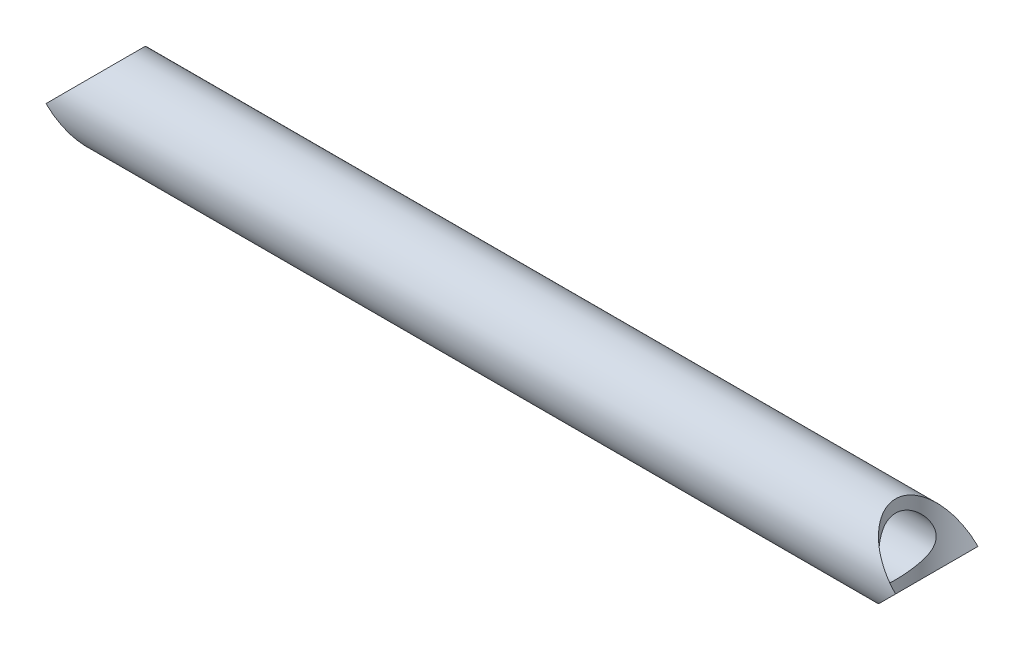
ISO-10303-21;
HEADER;
FILE_DESCRIPTION(('STEP AP214'),'2;1');
FILE_NAME('part.step','',(''),(''),'','','');
FILE_SCHEMA(('AUTOMOTIVE_DESIGN { 1 0 10303 214 1 1 1 1 }'));
ENDSEC;
DATA;
#1=APPLICATION_CONTEXT('core data for automotive mechanical design processes');
#2=APPLICATION_PROTOCOL_DEFINITION('international standard','automotive_design',2000,#1);
#3=PRODUCT_CONTEXT('',#1,'mechanical');
#4=PRODUCT('Part','Part','',(#3));
#5=PRODUCT_RELATED_PRODUCT_CATEGORY('part','',(#4));
#6=PRODUCT_DEFINITION_FORMATION('','',#4);
#7=PRODUCT_DEFINITION_CONTEXT('part definition',#1,'design');
#8=PRODUCT_DEFINITION('design','',#6,#7);
#9=PRODUCT_DEFINITION_SHAPE('','',#8);
#10=(LENGTH_UNIT() NAMED_UNIT(*) SI_UNIT(.MILLI.,.METRE.));
#11=(NAMED_UNIT(*) PLANE_ANGLE_UNIT() SI_UNIT($,.RADIAN.));
#12=(NAMED_UNIT(*) SI_UNIT($,.STERADIAN.) SOLID_ANGLE_UNIT());
#13=UNCERTAINTY_MEASURE_WITH_UNIT(LENGTH_MEASURE(1.E-05),#10,'distance_accuracy_value','');
#14=(GEOMETRIC_REPRESENTATION_CONTEXT(3) GLOBAL_UNCERTAINTY_ASSIGNED_CONTEXT((#13)) GLOBAL_UNIT_ASSIGNED_CONTEXT((#10,
#11,#12)) REPRESENTATION_CONTEXT('',''));
#15=CARTESIAN_POINT('',(0.,0.,0.));
#16=DIRECTION('',(0.,0.,1.));
#17=DIRECTION('',(1.,0.,0.));
#18=AXIS2_PLACEMENT_3D('',#15,#16,#17);
#19=CARTESIAN_POINT('',(0.,0.,0.));
#20=DIRECTION('',(1.,0.,0.));
#21=DIRECTION('',(0.,0.,-1.));
#22=AXIS2_PLACEMENT_3D('',#19,#20,#21);
#23=CYLINDRICAL_SURFACE('',#22,35.);
#24=CARTESIAN_POINT('',(35.7071421427142,0.,-35.));
#25=CARTESIAN_POINT('',(35.7071506960339,0.840107969640403,-34.999995372535));
#26=CARTESIAN_POINT('',(35.7369348035131,1.68027595587627,-34.9696838888615));
#27=CARTESIAN_POINT('',(35.8544471947958,3.35221612686096,-34.8491819248762));
#28=CARTESIAN_POINT('',(35.9421828399308,4.1839872313608,-34.7589838374224));
#29=CARTESIAN_POINT('',(36.1712293688525,5.83320919168844,-34.5205642195381));
#30=CARTESIAN_POINT('',(36.3126425511041,6.65062956617838,-34.3722318793915));
#31=CARTESIAN_POINT('',(36.6423988735656,8.26372825663241,-34.0204719036504));
#32=CARTESIAN_POINT('',(36.8307439251374,9.0594056856216,-33.8170420241069));
#33=CARTESIAN_POINT('',(37.2443889590487,10.6160962668867,-33.3608911380292));
#34=CARTESIAN_POINT('',(37.4692473366944,11.377399510945,-33.1087530503742));
#35=CARTESIAN_POINT('',(37.9498912115004,12.8722697515329,-32.5567138302996));
#36=CARTESIAN_POINT('',(38.2056760937748,13.6058372991278,-32.2568136474564));
#37=CARTESIAN_POINT('',(38.7410119421266,15.0436443658859,-31.6118578615202));
#38=CARTESIAN_POINT('',(39.020559923923,15.7478875512387,-31.2668079256177));
#39=CARTESIAN_POINT('',(39.5969082877492,17.1262102767459,-30.5336264742114));
#40=CARTESIAN_POINT('',(39.8937099050371,17.8002876510772,-30.1454918722869));
#41=CARTESIAN_POINT('',(40.551609749269,19.2329409336998,-29.2561784374031));
#42=CARTESIAN_POINT('',(40.914864074247,19.985636533046,-28.7471070972688));
#43=CARTESIAN_POINT('',(41.6482789820097,21.4471112794062,-27.6738766652288));
#44=CARTESIAN_POINT('',(42.0184400774716,22.1558871493288,-27.1097134706892));
#45=CARTESIAN_POINT('',(42.7582340933028,23.5287326231606,-25.9272125065644));
#46=CARTESIAN_POINT('',(43.127865884777,24.1927488103879,-25.3088119653039));
#47=CARTESIAN_POINT('',(43.8588504301021,25.4730222520025,-24.0197921583749));
#48=CARTESIAN_POINT('',(44.2202026109753,26.0892762080667,-23.3491692927814));
#49=CARTESIAN_POINT('',(44.9867285846432,27.3698937944522,-21.8408769297574));
#50=CARTESIAN_POINT('',(45.389154931207,28.0251298541144,-20.9940046961307));
#51=CARTESIAN_POINT('',(46.1625833914162,29.261175575932,-19.2338365369213));
#52=CARTESIAN_POINT('',(46.5335797092928,29.8419715212443,-18.3205284178719));
#53=CARTESIAN_POINT('',(47.2331338246412,30.9214761037239,-16.432938159996));
#54=CARTESIAN_POINT('',(47.561759750431,31.4203168818842,-15.4587577411312));
#55=CARTESIAN_POINT('',(48.0156533510476,32.1018921667805,-13.9560498011597));
#56=CARTESIAN_POINT('',(48.1604408743064,32.3179655365879,-13.4482527308478));
#57=CARTESIAN_POINT('',(48.4358774539447,32.7270090161536,-12.4197059332497));
#58=CARTESIAN_POINT('',(48.5665277966041,32.9199812279547,-11.8989573896723));
#59=CARTESIAN_POINT('',(48.8692939322469,33.36533512942,-10.6026563492037));
#60=CARTESIAN_POINT('',(49.0327544374962,33.6040865614514,-9.82032326239985));
#61=CARTESIAN_POINT('',(49.3238132945429,34.0273736921218,-8.23474760358175));
#62=CARTESIAN_POINT('',(49.4514179853557,34.2119189742274,-7.43150875500591));
#63=CARTESIAN_POINT('',(49.6680897633444,34.5243655933765,-5.80945738690225));
#64=CARTESIAN_POINT('',(49.7571815736647,34.6523032706249,-4.99065521170869));
#65=CARTESIAN_POINT('',(49.8949954169263,34.8499008596341,-3.3426287169344));
#66=CARTESIAN_POINT('',(49.9437160792339,34.9195587927502,-2.51340404447149));
#67=CARTESIAN_POINT('',(49.9997369695583,34.9996360491842,-0.849064569498375));
#68=CARTESIAN_POINT('',(50.0069561404409,35.0099394464219,-0.0139414278536153));
#69=CARTESIAN_POINT('',(49.9795905662272,34.9708402171738,1.65420898993208));
#70=CARTESIAN_POINT('',(49.9450059780367,34.9214378147871,2.48723627392784));
#71=CARTESIAN_POINT('',(49.8348110399218,34.7636530151837,4.14511747217352));
#72=CARTESIAN_POINT('',(49.7591911431662,34.6552568931089,4.96996943895306));
#73=CARTESIAN_POINT('',(49.5686015156259,34.3810407659299,6.60541848255173));
#74=CARTESIAN_POINT('',(49.4536317547529,34.2152207169174,7.41601554847058));
#75=CARTESIAN_POINT('',(49.1898587017827,33.8328374554661,8.99928619345004));
#76=CARTESIAN_POINT('',(49.0418920994671,33.6175256222774,9.77240316665133));
#77=CARTESIAN_POINT('',(48.7135826943793,33.1367465419105,11.2957516606701));
#78=CARTESIAN_POINT('',(48.5332406093663,32.8712804066381,12.0459836884118));
#79=CARTESIAN_POINT('',(48.1434050941599,32.2929262141351,13.5201301256891));
#80=CARTESIAN_POINT('',(47.9339096891927,31.9800349443149,14.2440427482201));
#81=CARTESIAN_POINT('',(47.4892792776534,31.3096561009199,15.6627291841093));
#82=CARTESIAN_POINT('',(47.2541427471497,30.9521658765087,16.357501262153));
#83=CARTESIAN_POINT('',(46.7342706947119,30.1528495944223,17.7919451807377));
#84=CARTESIAN_POINT('',(46.4469302640876,29.706061440908,18.5279083304046));
#85=CARTESIAN_POINT('',(45.8502583157375,28.7641961243084,19.9588293889626));
#86=CARTESIAN_POINT('',(45.5409254056233,28.2691159030151,20.6537846964576));
#87=CARTESIAN_POINT('',(44.905268593313,27.2332625058387,22.0016486225769));
#88=CARTESIAN_POINT('',(44.5789290915864,26.6924470851888,22.654517363894));
#89=CARTESIAN_POINT('',(43.9149486782088,25.5681155096849,23.9162202003436));
#90=CARTESIAN_POINT('',(43.5773072082628,24.9845972437003,24.525052115434));
#91=CARTESIAN_POINT('',(42.835453936168,23.6690082982129,25.8023689370088));
#92=CARTESIAN_POINT('',(42.4301260058014,22.92902281227,26.4620778543904));
#93=CARTESIAN_POINT('',(41.6212145950747,21.3950999291498,27.7169969188899));
#94=CARTESIAN_POINT('',(41.2176314814372,20.6011517256226,28.3121940848647));
#95=CARTESIAN_POINT('',(40.4229970554186,18.9613586582519,29.43560043687));
#96=CARTESIAN_POINT('',(40.0319444300682,18.1155192589181,29.9638166585617));
#97=CARTESIAN_POINT('',(39.274391070172,16.373534809267,30.9500992369552));
#98=CARTESIAN_POINT('',(38.9078831878682,15.4774045452744,31.4081860666885));
#99=CARTESIAN_POINT('',(38.2935106806577,13.8499610572788,32.1524984022248));
#100=CARTESIAN_POINT('',(38.0378273201614,13.1285437735056,32.4539558035031));
#101=CARTESIAN_POINT('',(37.5558036344604,11.658489952514,33.0105609907163));
#102=CARTESIAN_POINT('',(37.3294600136631,10.9098564844763,33.2657139790946));
#103=CARTESIAN_POINT('',(36.913619808298,9.38878642354701,33.7265624284367));
#104=CARTESIAN_POINT('',(36.7240655804419,8.61638930124983,33.9323353818856));
#105=CARTESIAN_POINT('',(36.3884746528101,7.05024847858442,34.2919745133211));
#106=CARTESIAN_POINT('',(36.2424374542712,6.25650502298735,34.4458412862246));
#107=CARTESIAN_POINT('',(35.9990014609517,4.64420789567828,34.7001963111161));
#108=CARTESIAN_POINT('',(35.9021245730269,3.82548200533228,34.8001124863692));
#109=CARTESIAN_POINT('',(35.7986174570841,2.59037712675722,34.9064627321118));
#110=CARTESIAN_POINT('',(35.7710820185749,2.17743677544965,34.9346598809064));
#111=CARTESIAN_POINT('',(35.7302726607355,1.35012910288847,34.9763998951334));
#112=CARTESIAN_POINT('',(35.7169969035873,0.935761972428675,34.9899446489994));
#113=CARTESIAN_POINT('',(35.7048954563494,0.106691028185822,35.0022927186814));
#114=CARTESIAN_POINT('',(35.7060667644854,-0.308012697754987,35.0010990967995));
#115=CARTESIAN_POINT('',(35.7228314393242,-1.13680514686352,34.9839886104874));
#116=CARTESIAN_POINT('',(35.7384241537951,-1.55089389699623,34.9680724119102));
#117=CARTESIAN_POINT('',(35.7838226288508,-2.3774371534342,34.9216136308916));
#118=CARTESIAN_POINT('',(35.8136272747461,-2.78989178535105,34.8910721955558));
#119=CARTESIAN_POINT('',(35.8870522222923,-3.61225163317412,34.8155455653265));
#120=CARTESIAN_POINT('',(35.9306737746918,-4.02215661485162,34.7705590628161));
#121=CARTESIAN_POINT('',(36.0674353440016,-5.13275958039296,34.628830086058));
#122=CARTESIAN_POINT('',(36.1736069266568,-5.83014671179401,34.5181524617777));
#123=CARTESIAN_POINT('',(36.4216177149305,-7.21081339858577,34.2563585102615));
#124=CARTESIAN_POINT('',(36.5634600998927,-7.89409169057616,34.1052385783199));
#125=CARTESIAN_POINT('',(36.7996706714261,-8.90638582719782,33.8496330627377));
#126=CARTESIAN_POINT('',(36.8823645332531,-9.24188471101654,33.7595558421607));
#127=CARTESIAN_POINT('',(37.0549594724068,-9.90825578804266,33.5700224936967));
#128=CARTESIAN_POINT('',(37.1448587128163,-10.2391291353681,33.4705687550979));
#129=CARTESIAN_POINT('',(37.4245511873983,-11.2247039209303,33.1584238688599));
#130=CARTESIAN_POINT('',(37.6243163755767,-11.8722636876034,32.9319734954838));
#131=CARTESIAN_POINT('',(38.1450116429683,-13.4471289901202,32.3292847026574));
#132=CARTESIAN_POINT('',(38.4786826354399,-14.3624821169311,31.9327431276927));
#133=CARTESIAN_POINT('',(39.17935195492,-16.1460468025932,31.0690795732735));
#134=CARTESIAN_POINT('',(39.5463636510368,-17.0142392257618,30.6019292305053));
#135=CARTESIAN_POINT('',(40.301755140756,-18.7030125712252,29.6000468705433));
#136=CARTESIAN_POINT('',(40.6901690992031,-19.5235128045581,29.0652049211536));
#137=CARTESIAN_POINT('',(41.4766613548323,-21.1137610555909,27.9313912336668));
#138=CARTESIAN_POINT('',(41.8747385293508,-21.8835149307104,27.3324269179354));
#139=CARTESIAN_POINT('',(42.6782094469072,-23.3845880727686,26.0604489027733));
#140=CARTESIAN_POINT('',(43.0835991051203,-24.1149044709452,25.3862484916673));
#141=CARTESIAN_POINT('',(43.8845241661419,-25.5182947538454,23.9751284614132));
#142=CARTESIAN_POINT('',(44.2800588422473,-26.1913644259963,23.2382042346232));
#143=CARTESIAN_POINT('',(45.0516121398882,-27.4756407183392,21.7045656028507));
#144=CARTESIAN_POINT('',(45.4276553690046,-28.0869263146648,20.9079298540213));
#145=CARTESIAN_POINT('',(46.1519228719792,-29.2438607968108,19.2564928275713));
#146=CARTESIAN_POINT('',(46.5001524117578,-29.7895221171094,18.4017026172605));
#147=CARTESIAN_POINT('',(47.1070354510041,-30.7274970425655,16.7795041914442));
#148=CARTESIAN_POINT('',(47.3710826196034,-31.130353940521,16.0201979371559));
#149=CARTESIAN_POINT('',(47.8686375255639,-31.8823772598025,14.4657940381274));
#150=CARTESIAN_POINT('',(48.1021481674375,-32.2315487880222,13.6706998070806));
#151=CARTESIAN_POINT('',(48.5338342134184,-32.8723150806321,12.0486880086856));
#152=CARTESIAN_POINT('',(48.7320243632472,-33.1639338778232,11.2217838975692));
#153=CARTESIAN_POINT('',(49.0888678981733,-33.686099501524,9.54051455852408));
#154=CARTESIAN_POINT('',(49.2475209407915,-33.9166457990113,8.68614909279145));
#155=CARTESIAN_POINT('',(49.5223628402394,-34.3145050274897,6.95066907682188));
#156=CARTESIAN_POINT('',(49.6382983456405,-34.4814408876361,6.06942746964133));
#157=CARTESIAN_POINT('',(49.8234712104536,-34.747480837529,4.29186573010808));
#158=CARTESIAN_POINT('',(49.89270839869,-34.8465846786329,3.39554554249624));
#159=CARTESIAN_POINT('',(49.9826479611912,-34.9752371825238,1.59576611558513));
#160=CARTESIAN_POINT('',(50.0033653249028,-35.0048073266787,0.692309167644005));
#161=CARTESIAN_POINT('',(49.9957458354449,-34.9939228964912,-1.11393360341865));
#162=CARTESIAN_POINT('',(49.967412667374,-34.9534735826137,-2.01671947185972));
#163=CARTESIAN_POINT('',(49.8675605979219,-34.8105711222887,-3.72659142724014));
#164=CARTESIAN_POINT('',(49.8004867088333,-34.7144977394336,-4.53448332214181));
#165=CARTESIAN_POINT('',(49.6284147166179,-34.4671937596204,-6.13760931900885));
#166=CARTESIAN_POINT('',(49.5234195177799,-34.3159673866695,-6.93284438545749));
#167=CARTESIAN_POINT('',(49.2776451215939,-33.9603123439271,-8.5057315286114));
#168=CARTESIAN_POINT('',(49.1368618620034,-33.755877634484,-9.28338159835413));
#169=CARTESIAN_POINT('',(48.8222529665738,-33.2962526672194,-10.8166637252959));
#170=CARTESIAN_POINT('',(48.6484257074945,-33.0410599159517,-11.5722946987338));
#171=CARTESIAN_POINT('',(48.2643074446274,-32.4728920278149,-13.0837972709848));
#172=CARTESIAN_POINT('',(48.052955251691,-32.1582105745043,-13.8387561939889));
#173=CARTESIAN_POINT('',(47.6021025925178,-31.4805362011754,-15.3178881400829));
#174=CARTESIAN_POINT('',(47.3626018142448,-31.117542745597,-16.042060821776));
#175=CARTESIAN_POINT('',(46.8595068054807,-30.3463145406757,-17.4571070426294));
#176=CARTESIAN_POINT('',(46.5959122060687,-29.938079098574,-18.1479800716629));
#177=CARTESIAN_POINT('',(46.0487444192928,-29.0791421274552,-19.4946500007173));
#178=CARTESIAN_POINT('',(45.7651687920868,-28.6284354100837,-20.1504425998801));
#179=CARTESIAN_POINT('',(45.305274720761,-27.8857225328781,-21.1564757921154));
#180=CARTESIAN_POINT('',(45.1341490192931,-27.6069328443119,-21.5189576356897));
#181=CARTESIAN_POINT('',(44.7875261838629,-27.0365267034799,-22.2313832619618));
#182=CARTESIAN_POINT('',(44.6120299247389,-26.744912809379,-22.5813295202048));
#183=CARTESIAN_POINT('',(44.0801378688905,-25.8512679541399,-23.6122700447218));
#184=CARTESIAN_POINT('',(43.7183422111443,-25.2304393012965,-24.2743586500883));
#185=CARTESIAN_POINT('',(42.986717528521,-23.9403587995707,-25.5476507252639));
#186=CARTESIAN_POINT('',(42.6168739385289,-23.2710129671869,-26.1587502186705));
#187=CARTESIAN_POINT('',(41.8771679212079,-21.8869665025461,-27.3272936639212));
#188=CARTESIAN_POINT('',(41.5073054939074,-21.1722634957601,-27.8847348028034));
#189=CARTESIAN_POINT('',(40.7178655377321,-19.5829695599545,-29.0277545461194));
#190=CARTESIAN_POINT('',(40.2996303035014,-18.7009229658389,-29.6039422453109));
#191=CARTESIAN_POINT('',(39.4874687483406,-16.8797062451459,-30.6788813859251));
#192=CARTESIAN_POINT('',(39.0935492998776,-15.9405201165736,-31.177610994896));
#193=CARTESIAN_POINT('',(38.3468520577183,-14.00970137275,-32.0915302946143));
#194=CARTESIAN_POINT('',(37.9939747623268,-13.0182044454697,-32.5069238759459));
#195=CARTESIAN_POINT('',(37.3461510738313,-10.9845988078023,-33.2491818357296));
#196=CARTESIAN_POINT('',(37.0511647388101,-9.94252561611601,-33.5761073122506));
#197=CARTESIAN_POINT('',(36.6226388034773,-8.16673687167302,-34.0418372383946));
#198=CARTESIAN_POINT('',(36.4679655418352,-7.44496965137639,-34.2071029882412));
#199=CARTESIAN_POINT('',(36.1981999556148,-5.98528009630567,-34.4924486251216));
#200=CARTESIAN_POINT('',(36.0830992907113,-5.24736120057574,-34.6125380340294));
#201=CARTESIAN_POINT('',(35.897105098182,-3.76095860921782,-34.80540039525));
#202=CARTESIAN_POINT('',(35.8261438552186,-3.01249290688711,-34.878245833023));
#203=CARTESIAN_POINT('',(35.7311564440406,-1.5093679786863,-34.9755498701451));
#204=CARTESIAN_POINT('',(35.7071344588679,-0.754708206842459,-35.0000041570678));
#205=CARTESIAN_POINT('',(35.7071421427142,0.,-35.));
#206=B_SPLINE_CURVE_WITH_KNOTS('',3,(#24,#25,#26,#27,#28,#29,#30,#31,#32,#33,#34,#35,#36,#37,
#38,#39,#40,#41,#42,#43,#44,#45,#46,#47,#48,#49,#50,#51,#52,#53,#54,#55,#56,#57,#58,#59,#60,#61,
#62,#63,#64,#65,#66,#67,#68,#69,#70,#71,#72,#73,#74,#75,#76,#77,#78,#79,#80,#81,#82,#83,#84,#85,
#86,#87,#88,#89,#90,#91,#92,#93,#94,#95,#96,#97,#98,#99,#100,#101,#102,#103,#104,#105,#106,#107,
#108,#109,#110,#111,#112,#113,#114,#115,#116,#117,#118,#119,#120,#121,#122,#123,#124,#125,#126,
#127,#128,#129,#130,#131,#132,#133,#134,#135,#136,#137,#138,#139,#140,#141,#142,#143,#144,#145,
#146,#147,#148,#149,#150,#151,#152,#153,#154,#155,#156,#157,#158,#159,#160,#161,#162,#163,#164,
#165,#166,#167,#168,#169,#170,#171,#172,#173,#174,#175,#176,#177,#178,#179,#180,#181,#182,#183,
#184,#185,#186,#187,#188,#189,#190,#191,#192,#193,#194,#195,#196,#197,#198,#199,#200,#201,#202,
#203,#204,#205),.UNSPECIFIED.,.T.,.F.,(4,2,2,2,2,2,2,2,2,2,2,2,2,2,2,2,2,2,2,2,2,2,2,2,2,2,2,2,
2,2,2,2,2,2,2,2,2,2,2,2,2,2,2,2,2,2,2,2,2,2,2,2,2,2,2,2,2,2,2,2,2,2,2,2,2,2,2,2,2,2,2,2,2,2,2,2,
2,2,2,2,2,2,2,2,2,2,2,2,2,2,4),(0.,2.51937866427342,5.03907741580433,7.56360250876945,
10.0882304331426,12.5843322553073,15.0803844577134,17.5761236560116,20.0720417550408,
23.0051397161625,25.9384562688945,28.8752136656239,31.8121736860625,35.2391435548816,
38.6667439954376,42.0887624993612,43.7996953865138,45.5104724722832,48.0100243114239,
50.5091339717734,53.0066369505803,55.5042247182006,58.0066889059335,60.5091437009683,
63.0121809398334,65.5152200926113,67.9608365527419,70.4063988006499,72.8521267856099,
75.2980002070769,78.0183021621446,80.738776498668,83.4617917237844,86.1849416595811,
89.3946103526887,92.6049237053712,95.8148995677452,99.0239365403022,101.48975503957,
103.955296324787,106.416942736103,108.878560932582,111.365792918491,112.60982351497,
113.853693758897,115.097305559003,116.340861117453,117.584319155706,118.827889787785,
120.967607439389,123.107515871967,124.178586002065,125.249383940071,127.391285251522,
130.542393968124,133.694771855559,136.852336572213,140.009536185203,143.226476554708,
146.443653442402,149.656664501507,152.869065797363,155.564040644996,158.258758970658,
160.952349647025,163.645963655054,166.355305307157,169.064656890469,171.773171351185,
174.48148233379,176.927676405827,179.373683170305,181.819967700969,184.266372433007,
186.798189652957,189.330034941575,191.861919003928,194.394112766985,195.85858426996,
197.322764954496,200.251155740817,203.185379115735,206.119756229405,209.516188906609,
212.913577176739,216.302549186755,219.689174688125,221.956212393578,224.222772004585,
226.485845800691,228.749121263825),.UNSPECIFIED.);
#207=CARTESIAN_POINT('',(35.7071421427142,0.,-35.));
#208=VERTEX_POINT('',#207);
#209=EDGE_CURVE('E37',#208,#208,#206,.T.);
#210=ORIENTED_EDGE('',*,*,#209,.F.);
#211=EDGE_LOOP('',(#210));
#212=FACE_BOUND('',#211,.T.);
#213=CARTESIAN_POINT('',(994.292857857286,0.,-35.));
#214=CARTESIAN_POINT('',(994.292849303966,-0.840107969640405,-34.999995372535));
#215=CARTESIAN_POINT('',(994.263065196487,-1.68027595587627,-34.9696838888615));
#216=CARTESIAN_POINT('',(994.145552805204,-3.35221612686097,-34.8491819248762));
#217=CARTESIAN_POINT('',(994.057817160069,-4.18398723136081,-34.7589838374224));
#218=CARTESIAN_POINT('',(993.828770631147,-5.83320919168845,-34.5205642195381));
#219=CARTESIAN_POINT('',(993.687357448896,-6.65062956617838,-34.3722318793915));
#220=CARTESIAN_POINT('',(993.357601126434,-8.26372825663241,-34.0204719036504));
#221=CARTESIAN_POINT('',(993.169256074863,-9.05940568562161,-33.8170420241069));
#222=CARTESIAN_POINT('',(992.755611040951,-10.6160962668867,-33.3608911380292));
#223=CARTESIAN_POINT('',(992.530752663306,-11.377399510945,-33.1087530503742));
#224=CARTESIAN_POINT('',(992.0501087885,-12.8722697515329,-32.5567138302996));
#225=CARTESIAN_POINT('',(991.794323906225,-13.6058372991277,-32.2568136474564));
#226=CARTESIAN_POINT('',(991.258988057873,-15.0436443658859,-31.6118578615202));
#227=CARTESIAN_POINT('',(990.979440076077,-15.7478875512386,-31.2668079256177));
#228=CARTESIAN_POINT('',(990.403091712251,-17.1262102767458,-30.5336264742114));
#229=CARTESIAN_POINT('',(990.106290094963,-17.8002876510772,-30.1454918722869));
#230=CARTESIAN_POINT('',(989.448390250731,-19.2329409336998,-29.2561784374032));
#231=CARTESIAN_POINT('',(989.085135925753,-19.985636533046,-28.7471070972688));
#232=CARTESIAN_POINT('',(988.35172101799,-21.4471112794062,-27.6738766652288));
#233=CARTESIAN_POINT('',(987.981559922528,-22.1558871493288,-27.1097134706891));
#234=CARTESIAN_POINT('',(987.241765906697,-23.5287326231607,-25.9272125065644));
#235=CARTESIAN_POINT('',(986.872134115223,-24.1927488103879,-25.3088119653039));
#236=CARTESIAN_POINT('',(986.141149569898,-25.4730222520026,-24.0197921583748));
#237=CARTESIAN_POINT('',(985.779797389025,-26.0892762080667,-23.3491692927813));
#238=CARTESIAN_POINT('',(985.013271415357,-27.3698937944522,-21.8408769297574));
#239=CARTESIAN_POINT('',(984.610845068793,-28.0251298541144,-20.9940046961307));
#240=CARTESIAN_POINT('',(983.837416608584,-29.261175575932,-19.2338365369213));
#241=CARTESIAN_POINT('',(983.466420290707,-29.8419715212443,-18.3205284178719));
#242=CARTESIAN_POINT('',(982.766866175359,-30.9214761037239,-16.4329381599959));
#243=CARTESIAN_POINT('',(982.438240249569,-31.4203168818842,-15.4587577411312));
#244=CARTESIAN_POINT('',(981.984346648952,-32.1018921667805,-13.9560498011596));
#245=CARTESIAN_POINT('',(981.839559125694,-32.317965536588,-13.4482527308477));
#246=CARTESIAN_POINT('',(981.564122546055,-32.7270090161536,-12.4197059332497));
#247=CARTESIAN_POINT('',(981.433472203396,-32.9199812279547,-11.8989573896723));
#248=CARTESIAN_POINT('',(981.130706067753,-33.36533512942,-10.6026563492037));
#249=CARTESIAN_POINT('',(980.967245562504,-33.6040865614514,-9.82032326239983));
#250=CARTESIAN_POINT('',(980.676186705457,-34.0273736921218,-8.23474760358173));
#251=CARTESIAN_POINT('',(980.548582014644,-34.2119189742274,-7.4315087550059));
#252=CARTESIAN_POINT('',(980.331910236656,-34.5243655933765,-5.80945738690225));
#253=CARTESIAN_POINT('',(980.242818426335,-34.6523032706249,-4.99065521170868));
#254=CARTESIAN_POINT('',(980.105004583074,-34.8499008596341,-3.34262871693439));
#255=CARTESIAN_POINT('',(980.056283920766,-34.9195587927502,-2.51340404447148));
#256=CARTESIAN_POINT('',(980.000263030442,-34.9996360491842,-0.849064569498357));
#257=CARTESIAN_POINT('',(979.993043859559,-35.0099394464219,-0.0139414278535961));
#258=CARTESIAN_POINT('',(980.020409433773,-34.9708402171738,1.6542089899321));
#259=CARTESIAN_POINT('',(980.054994021963,-34.9214378147871,2.48723627392786));
#260=CARTESIAN_POINT('',(980.165188960078,-34.7636530151837,4.14511747217355));
#261=CARTESIAN_POINT('',(980.240808856834,-34.6552568931089,4.96996943895309));
#262=CARTESIAN_POINT('',(980.431398484374,-34.3810407659299,6.60541848255175));
#263=CARTESIAN_POINT('',(980.546368245247,-34.2152207169174,7.4160155484706));
#264=CARTESIAN_POINT('',(980.810141298217,-33.8328374554661,8.99928619345006));
#265=CARTESIAN_POINT('',(980.958107900533,-33.6175256222773,9.77240316665135));
#266=CARTESIAN_POINT('',(981.286417305621,-33.1367465419104,11.2957516606701));
#267=CARTESIAN_POINT('',(981.466759390634,-32.8712804066381,12.0459836884118));
#268=CARTESIAN_POINT('',(981.85659490584,-32.2929262141351,13.5201301256891));
#269=CARTESIAN_POINT('',(982.066090310807,-31.9800349443149,14.2440427482201));
#270=CARTESIAN_POINT('',(982.510720722347,-31.3096561009198,15.6627291841093));
#271=CARTESIAN_POINT('',(982.74585725285,-30.9521658765087,16.357501262153));
#272=CARTESIAN_POINT('',(983.265729305288,-30.1528495944223,17.7919451807377));
#273=CARTESIAN_POINT('',(983.553069735912,-29.7060614409079,18.5279083304047));
#274=CARTESIAN_POINT('',(984.149741684263,-28.7641961243084,19.9588293889626));
#275=CARTESIAN_POINT('',(984.459074594377,-28.2691159030151,20.6537846964577));
#276=CARTESIAN_POINT('',(985.094731406687,-27.2332625058387,22.0016486225769));
#277=CARTESIAN_POINT('',(985.421070908414,-26.6924470851888,22.654517363894));
#278=CARTESIAN_POINT('',(986.085051321791,-25.5681155096849,23.9162202003436));
#279=CARTESIAN_POINT('',(986.422692791737,-24.9845972437002,24.525052115434));
#280=CARTESIAN_POINT('',(987.164546063832,-23.6690082982129,25.8023689370088));
#281=CARTESIAN_POINT('',(987.569873994199,-22.92902281227,26.4620778543905));
#282=CARTESIAN_POINT('',(988.378785404925,-21.3950999291498,27.7169969188899));
#283=CARTESIAN_POINT('',(988.782368518563,-20.6011517256226,28.3121940848647));
#284=CARTESIAN_POINT('',(989.577002944581,-18.9613586582518,29.43560043687));
#285=CARTESIAN_POINT('',(989.968055569932,-18.1155192589181,29.9638166585617));
#286=CARTESIAN_POINT('',(990.725608929828,-16.373534809267,30.9500992369552));
#287=CARTESIAN_POINT('',(991.092116812132,-15.4774045452743,31.4081860666885));
#288=CARTESIAN_POINT('',(991.706489319342,-13.8499610572788,32.1524984022248));
#289=CARTESIAN_POINT('',(991.962172679839,-13.1285437735056,32.4539558035031));
#290=CARTESIAN_POINT('',(992.44419636554,-11.658489952514,33.0105609907163));
#291=CARTESIAN_POINT('',(992.670539986337,-10.9098564844763,33.2657139790947));
#292=CARTESIAN_POINT('',(993.086380191702,-9.38878642354698,33.7265624284368));
#293=CARTESIAN_POINT('',(993.275934419558,-8.61638930124982,33.9323353818856));
#294=CARTESIAN_POINT('',(993.61152534719,-7.05024847858441,34.2919745133211));
#295=CARTESIAN_POINT('',(993.757562545729,-6.25650502298732,34.4458412862246));
#296=CARTESIAN_POINT('',(994.000998539048,-4.64420789567823,34.7001963111161));
#297=CARTESIAN_POINT('',(994.097875426973,-3.82548200533223,34.8001124863692));
#298=CARTESIAN_POINT('',(994.201382542916,-2.59037712675717,34.9064627321118));
#299=CARTESIAN_POINT('',(994.228917981425,-2.17743677544961,34.9346598809064));
#300=CARTESIAN_POINT('',(994.269727339265,-1.35012910288843,34.9763998951334));
#301=CARTESIAN_POINT('',(994.283003096413,-0.935761972428634,34.9899446489994));
#302=CARTESIAN_POINT('',(994.295104543651,-0.106691028185778,35.0022927186814));
#303=CARTESIAN_POINT('',(994.293933235515,0.30801269775503,35.0010990967995));
#304=CARTESIAN_POINT('',(994.277168560676,1.13680514686356,34.9839886104874));
#305=CARTESIAN_POINT('',(994.261575846205,1.55089389699628,34.9680724119102));
#306=CARTESIAN_POINT('',(994.216177371149,2.37743715343425,34.9216136308916));
#307=CARTESIAN_POINT('',(994.186372725254,2.7898917853511,34.8910721955558));
#308=CARTESIAN_POINT('',(994.112947777708,3.61225163317417,34.8155455653265));
#309=CARTESIAN_POINT('',(994.069326225308,4.02215661485167,34.7705590628161));
#310=CARTESIAN_POINT('',(993.932564655998,5.132759580393,34.628830086058));
#311=CARTESIAN_POINT('',(993.826393073343,5.83014671179407,34.5181524617777));
#312=CARTESIAN_POINT('',(993.57838228507,7.21081339858581,34.2563585102615));
#313=CARTESIAN_POINT('',(993.436539900107,7.8940916905762,34.1052385783199));
#314=CARTESIAN_POINT('',(993.200329328574,8.90638582719784,33.8496330627377));
#315=CARTESIAN_POINT('',(993.117635466747,9.24188471101655,33.7595558421607));
#316=CARTESIAN_POINT('',(992.945040527593,9.90825578804266,33.5700224936967));
#317=CARTESIAN_POINT('',(992.855141287184,10.2391291353681,33.4705687550979));
#318=CARTESIAN_POINT('',(992.575448812602,11.2247039209303,33.1584238688599));
#319=CARTESIAN_POINT('',(992.375683624423,11.8722636876035,32.9319734954838));
#320=CARTESIAN_POINT('',(991.854988357032,13.4471289901202,32.3292847026574));
#321=CARTESIAN_POINT('',(991.52131736456,14.3624821169311,31.9327431276927));
#322=CARTESIAN_POINT('',(990.82064804508,16.1460468025933,31.0690795732735));
#323=CARTESIAN_POINT('',(990.453636348963,17.0142392257619,30.6019292305053));
#324=CARTESIAN_POINT('',(989.698244859244,18.7030125712253,29.6000468705432));
#325=CARTESIAN_POINT('',(989.309830900797,19.5235128045581,29.0652049211535));
#326=CARTESIAN_POINT('',(988.523338645168,21.1137610555909,27.9313912336668));
#327=CARTESIAN_POINT('',(988.125261470649,21.8835149307104,27.3324269179354));
#328=CARTESIAN_POINT('',(987.321790553093,23.3845880727686,26.0604489027733));
#329=CARTESIAN_POINT('',(986.91640089488,24.1149044709452,25.3862484916672));
#330=CARTESIAN_POINT('',(986.115475833858,25.5182947538455,23.9751284614131));
#331=CARTESIAN_POINT('',(985.719941157753,26.1913644259963,23.2382042346231));
#332=CARTESIAN_POINT('',(984.948387860112,27.4756407183393,21.7045656028507));
#333=CARTESIAN_POINT('',(984.572344630995,28.0869263146648,20.9079298540213));
#334=CARTESIAN_POINT('',(983.848077128021,29.2438607968108,19.2564928275713));
#335=CARTESIAN_POINT('',(983.499847588242,29.7895221171094,18.4017026172605));
#336=CARTESIAN_POINT('',(982.892964548996,30.7274970425655,16.7795041914441));
#337=CARTESIAN_POINT('',(982.628917380397,31.130353940521,16.0201979371559));
#338=CARTESIAN_POINT('',(982.131362474436,31.8823772598025,14.4657940381274));
#339=CARTESIAN_POINT('',(981.897851832563,32.2315487880222,13.6706998070806));
#340=CARTESIAN_POINT('',(981.466165786582,32.8723150806322,12.0486880086855));
#341=CARTESIAN_POINT('',(981.267975636753,33.1639338778232,11.2217838975691));
#342=CARTESIAN_POINT('',(980.911132101827,33.686099501524,9.54051455852401));
#343=CARTESIAN_POINT('',(980.752479059208,33.9166457990114,8.68614909279136));
#344=CARTESIAN_POINT('',(980.477637159761,34.3145050274897,6.95066907682178));
#345=CARTESIAN_POINT('',(980.36170165436,34.4814408876361,6.06942746964124));
#346=CARTESIAN_POINT('',(980.176528789546,34.747480837529,4.29186573010801));
#347=CARTESIAN_POINT('',(980.10729160131,34.8465846786329,3.39554554249617));
#348=CARTESIAN_POINT('',(980.017352038809,34.9752371825238,1.59576611558506));
#349=CARTESIAN_POINT('',(979.996634675097,35.0048073266787,0.692309167643948));
#350=CARTESIAN_POINT('',(980.004254164555,34.9939228964912,-1.11393360341871));
#351=CARTESIAN_POINT('',(980.032587332626,34.9534735826137,-2.0167194718598));
#352=CARTESIAN_POINT('',(980.132439402078,34.8105711222887,-3.72659142724024));
#353=CARTESIAN_POINT('',(980.199513291167,34.7144977394336,-4.53448332214192));
#354=CARTESIAN_POINT('',(980.371585283382,34.4671937596204,-6.13760931900897));
#355=CARTESIAN_POINT('',(980.47658048222,34.3159673866694,-6.93284438545761));
#356=CARTESIAN_POINT('',(980.722354878406,33.9603123439271,-8.50573152861151));
#357=CARTESIAN_POINT('',(980.863138137997,33.755877634484,-9.28338159835423));
#358=CARTESIAN_POINT('',(981.177747033426,33.2962526672194,-10.816663725296));
#359=CARTESIAN_POINT('',(981.351574292506,33.0410599159516,-11.5722946987338));
#360=CARTESIAN_POINT('',(981.735692555373,32.4728920278148,-13.0837972709849));
#361=CARTESIAN_POINT('',(981.947044748309,32.1582105745043,-13.838756193989));
#362=CARTESIAN_POINT('',(982.397897407482,31.4805362011754,-15.3178881400829));
#363=CARTESIAN_POINT('',(982.637398185755,31.1175427455969,-16.0420608217761));
#364=CARTESIAN_POINT('',(983.140493194519,30.3463145406756,-17.4571070426295));
#365=CARTESIAN_POINT('',(983.404087793931,29.9380790985739,-18.147980071663));
#366=CARTESIAN_POINT('',(983.951255580707,29.0791421274551,-19.4946500007173));
#367=CARTESIAN_POINT('',(984.234831207913,28.6284354100836,-20.1504425998801));
#368=CARTESIAN_POINT('',(984.694725279239,27.885722532878,-21.1564757921155));
#369=CARTESIAN_POINT('',(984.865850980707,27.6069328443119,-21.5189576356898));
#370=CARTESIAN_POINT('',(985.212473816137,27.0365267034798,-22.2313832619618));
#371=CARTESIAN_POINT('',(985.387970075261,26.744912809379,-22.5813295202048));
#372=CARTESIAN_POINT('',(985.91986213111,25.8512679541399,-23.6122700447219));
#373=CARTESIAN_POINT('',(986.281657788856,25.2304393012964,-24.2743586500883));
#374=CARTESIAN_POINT('',(987.013282471479,23.9403587995707,-25.5476507252639));
#375=CARTESIAN_POINT('',(987.383126061471,23.2710129671868,-26.1587502186706));
#376=CARTESIAN_POINT('',(988.122832078792,21.8869665025459,-27.3272936639213));
#377=CARTESIAN_POINT('',(988.492694506093,21.17226349576,-27.8847348028034));
#378=CARTESIAN_POINT('',(989.282134462268,19.5829695599544,-29.0277545461195));
#379=CARTESIAN_POINT('',(989.700369696499,18.7009229658388,-29.603942245311));
#380=CARTESIAN_POINT('',(990.512531251659,16.8797062451457,-30.6788813859252));
#381=CARTESIAN_POINT('',(990.906450700122,15.9405201165734,-31.1776109948961));
#382=CARTESIAN_POINT('',(991.653147942282,14.0097013727498,-32.0915302946144));
#383=CARTESIAN_POINT('',(992.006025237673,13.0182044454695,-32.5069238759459));
#384=CARTESIAN_POINT('',(992.653848926169,10.9845988078021,-33.2491818357297));
#385=CARTESIAN_POINT('',(992.94883526119,9.94252561611584,-33.5761073122507));
#386=CARTESIAN_POINT('',(993.377361196523,8.16673687167287,-34.0418372383946));
#387=CARTESIAN_POINT('',(993.532034458165,7.44496965137625,-34.2071029882412));
#388=CARTESIAN_POINT('',(993.801800044385,5.98528009630558,-34.4924486251217));
#389=CARTESIAN_POINT('',(993.916900709289,5.24736120057566,-34.6125380340294));
#390=CARTESIAN_POINT('',(994.102894901818,3.76095860921778,-34.80540039525));
#391=CARTESIAN_POINT('',(994.173856144781,3.01249290688708,-34.878245833023));
#392=CARTESIAN_POINT('',(994.268843555959,1.50936797868628,-34.9755498701451));
#393=CARTESIAN_POINT('',(994.292865541132,0.754708206842448,-35.0000041570678));
#394=CARTESIAN_POINT('',(994.292857857286,0.,-35.));
#395=B_SPLINE_CURVE_WITH_KNOTS('',3,(#213,#214,#215,#216,#217,#218,#219,#220,#221,#222,#223,
#224,#225,#226,#227,#228,#229,#230,#231,#232,#233,#234,#235,#236,#237,#238,#239,#240,#241,#242,
#243,#244,#245,#246,#247,#248,#249,#250,#251,#252,#253,#254,#255,#256,#257,#258,#259,#260,#261,
#262,#263,#264,#265,#266,#267,#268,#269,#270,#271,#272,#273,#274,#275,#276,#277,#278,#279,#280,
#281,#282,#283,#284,#285,#286,#287,#288,#289,#290,#291,#292,#293,#294,#295,#296,#297,#298,#299,
#300,#301,#302,#303,#304,#305,#306,#307,#308,#309,#310,#311,#312,#313,#314,#315,#316,#317,#318,
#319,#320,#321,#322,#323,#324,#325,#326,#327,#328,#329,#330,#331,#332,#333,#334,#335,#336,#337,
#338,#339,#340,#341,#342,#343,#344,#345,#346,#347,#348,#349,#350,#351,#352,#353,#354,#355,#356,
#357,#358,#359,#360,#361,#362,#363,#364,#365,#366,#367,#368,#369,#370,#371,#372,#373,#374,#375,
#376,#377,#378,#379,#380,#381,#382,#383,#384,#385,#386,#387,#388,#389,#390,#391,#392,#393,#394),
.UNSPECIFIED.,.T.,.F.,(4,2,2,2,2,2,2,2,2,2,2,2,2,2,2,2,2,2,2,2,2,2,2,2,2,2,2,2,2,2,2,2,2,2,2,2,
2,2,2,2,2,2,2,2,2,2,2,2,2,2,2,2,2,2,2,2,2,2,2,2,2,2,2,2,2,2,2,2,2,2,2,2,2,2,2,2,2,2,2,2,2,2,2,2,
2,2,2,2,2,2,4),(0.,2.51937866427343,5.03907741580434,7.56360250876946,10.0882304331426,
12.5843322553073,15.0803844577134,17.5761236560115,20.0720417550408,23.0051397161625,
25.9384562688946,28.8752136656239,31.8121736860626,35.2391435548816,38.6667439954377,
42.0887624993613,43.7996953865139,45.5104724722832,48.0100243114239,50.5091339717734,
53.0066369505804,55.5042247182007,58.0066889059335,60.5091437009683,63.0121809398334,
65.5152200926113,67.9608365527419,70.40639880065,72.85212678561,75.2980002070769,
78.0183021621446,80.7387764986681,83.4617917237844,86.1849416595811,89.3946103526887,
92.6049237053712,95.8148995677453,99.0239365403022,101.48975503957,103.955296324787,
106.416942736103,108.878560932582,111.365792918491,112.60982351497,113.853693758897,
115.097305559003,116.340861117453,117.584319155706,118.827889787785,120.967607439389,
123.107515871967,124.178586002065,125.249383940071,127.391285251522,130.542393968124,
133.694771855559,136.852336572213,140.009536185204,143.226476554709,146.443653442402,
149.656664501507,152.869065797364,155.564040644996,158.258758970658,160.952349647025,
163.645963655054,166.355305307157,169.064656890469,171.773171351185,174.48148233379,
176.927676405827,179.373683170306,181.819967700969,184.266372433007,186.798189652957,
189.330034941575,191.861919003928,194.394112766985,195.858584269961,197.322764954497,
200.251155740817,203.185379115736,206.119756229405,209.516188906609,212.913577176739,
216.302549186756,219.689174688125,221.956212393578,224.222772004585,226.485845800691,
228.749121263825),.UNSPECIFIED.);
#396=CARTESIAN_POINT('',(994.292857857286,0.,-35.));
#397=VERTEX_POINT('',#396);
#398=EDGE_CURVE('E68',#397,#397,#395,.T.);
#399=ORIENTED_EDGE('',*,*,#398,.F.);
#400=EDGE_LOOP('',(#399));
#401=FACE_BOUND('',#400,.T.);
#402=ADVANCED_FACE('F33',(#212,#401),#23,.F.);
#403=CARTESIAN_POINT('',(1030.,-50.,0.));
#404=DIRECTION('',(0.,1.,0.));
#405=DIRECTION('',(0.,0.,1.));
#406=AXIS2_PLACEMENT_3D('',#403,#404,#405);
#407=CYLINDRICAL_SURFACE('',#406,50.);
#408=CARTESIAN_POINT('',(1030.,0.,0.));
#409=DIRECTION('',(0.707106781186547,0.707106781186547,0.));
#410=DIRECTION('',(0.707106781186547,-0.707106781186547,0.));
#411=AXIS2_PLACEMENT_3D('',#408,#409,#410);
#412=ELLIPSE('',#411,70.7106781186548,50.);
#413=CARTESIAN_POINT('',(1030.,0.,-50.));
#414=VERTEX_POINT('',#413);
#415=CARTESIAN_POINT('',(1030.,0.,50.));
#416=VERTEX_POINT('',#415);
#417=EDGE_CURVE('E61',#414,#416,#412,.T.);
#418=ORIENTED_EDGE('',*,*,#417,.T.);
#419=CARTESIAN_POINT('',(1030.,0.,0.));
#420=DIRECTION('',(0.707106781186547,-0.707106781186547,0.));
#421=DIRECTION('',(0.707106781186547,0.707106781186547,0.));
#422=AXIS2_PLACEMENT_3D('',#419,#420,#421);
#423=ELLIPSE('',#422,70.7106781186548,50.);
#424=EDGE_CURVE('E65',#416,#414,#423,.T.);
#425=ORIENTED_EDGE('',*,*,#424,.T.);
#426=EDGE_LOOP('',(#418,#425));
#427=FACE_BOUND('',#426,.T.);
#428=ORIENTED_EDGE('',*,*,#398,.T.);
#429=EDGE_LOOP('',(#428));
#430=FACE_BOUND('',#429,.T.);
#431=ADVANCED_FACE('F63',(#427,#430),#407,.F.);
#432=CARTESIAN_POINT('',(0.,-50.,0.));
#433=DIRECTION('',(0.,1.,0.));
#434=DIRECTION('',(0.,0.,1.));
#435=AXIS2_PLACEMENT_3D('',#432,#433,#434);
#436=CYLINDRICAL_SURFACE('',#435,50.);
#437=CARTESIAN_POINT('',(0.,0.,0.));
#438=DIRECTION('',(0.707106781186547,0.707106781186547,0.));
#439=DIRECTION('',(0.707106781186547,-0.707106781186547,0.));
#440=AXIS2_PLACEMENT_3D('',#437,#438,#439);
#441=ELLIPSE('',#440,70.7106781186548,50.);
#442=CARTESIAN_POINT('',(0.,0.,-50.));
#443=VERTEX_POINT('',#442);
#444=CARTESIAN_POINT('',(0.,0.,50.));
#445=VERTEX_POINT('',#444);
#446=EDGE_CURVE('E11',#443,#445,#441,.F.);
#447=ORIENTED_EDGE('',*,*,#446,.T.);
#448=CARTESIAN_POINT('',(0.,0.,0.));
#449=DIRECTION('',(0.707106781186547,-0.707106781186547,0.));
#450=DIRECTION('',(0.707106781186547,0.707106781186547,0.));
#451=AXIS2_PLACEMENT_3D('',#448,#449,#450);
#452=ELLIPSE('',#451,70.7106781186548,50.);
#453=EDGE_CURVE('E46',#445,#443,#452,.F.);
#454=ORIENTED_EDGE('',*,*,#453,.T.);
#455=EDGE_LOOP('',(#447,#454));
#456=FACE_BOUND('',#455,.T.);
#457=ORIENTED_EDGE('',*,*,#209,.T.);
#458=EDGE_LOOP('',(#457));
#459=FACE_BOUND('',#458,.T.);
#460=ADVANCED_FACE('F79',(#456,#459),#436,.F.);
#461=CARTESIAN_POINT('',(0.,0.,0.));
#462=DIRECTION('',(1.,0.,0.));
#463=DIRECTION('',(0.,0.,-1.));
#464=AXIS2_PLACEMENT_3D('',#461,#462,#463);
#465=CYLINDRICAL_SURFACE('',#464,50.);
#466=ORIENTED_EDGE('',*,*,#453,.F.);
#467=ORIENTED_EDGE('',*,*,#446,.F.);
#468=EDGE_LOOP('',(#466,#467));
#469=FACE_BOUND('',#468,.T.);
#470=ORIENTED_EDGE('',*,*,#417,.F.);
#471=ORIENTED_EDGE('',*,*,#424,.F.);
#472=EDGE_LOOP('',(#470,#471));
#473=FACE_BOUND('',#472,.T.);
#474=ADVANCED_FACE('F35',(#469,#473),#465,.T.);
#475=CLOSED_SHELL('',(#402,#431,#460,#474));
#476=MANIFOLD_SOLID_BREP('B2',#475);
#477=ADVANCED_BREP_SHAPE_REPRESENTATION('',(#18,#476),#14);
#478=SHAPE_DEFINITION_REPRESENTATION(#9,#477);
ENDSEC;
END-ISO-10303-21;
